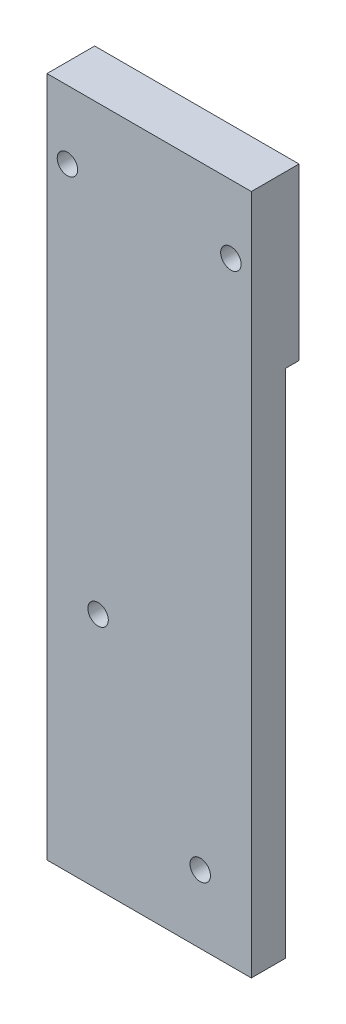
ISO-10303-21;
HEADER;
FILE_DESCRIPTION(('STEP AP214'),'2;1');
FILE_NAME('part.step','',(''),(''),'','','');
FILE_SCHEMA(('AUTOMOTIVE_DESIGN { 1 0 10303 214 1 1 1 1 }'));
ENDSEC;
DATA;
#1=APPLICATION_CONTEXT('core data for automotive mechanical design processes');
#2=APPLICATION_PROTOCOL_DEFINITION('international standard','automotive_design',2000,#1);
#3=PRODUCT_CONTEXT('',#1,'mechanical');
#4=PRODUCT('Part','Part','',(#3));
#5=PRODUCT_RELATED_PRODUCT_CATEGORY('part','',(#4));
#6=PRODUCT_DEFINITION_FORMATION('','',#4);
#7=PRODUCT_DEFINITION_CONTEXT('part definition',#1,'design');
#8=PRODUCT_DEFINITION('design','',#6,#7);
#9=PRODUCT_DEFINITION_SHAPE('','',#8);
#10=(LENGTH_UNIT() NAMED_UNIT(*) SI_UNIT(.MILLI.,.METRE.));
#11=(NAMED_UNIT(*) PLANE_ANGLE_UNIT() SI_UNIT($,.RADIAN.));
#12=(NAMED_UNIT(*) SI_UNIT($,.STERADIAN.) SOLID_ANGLE_UNIT());
#13=UNCERTAINTY_MEASURE_WITH_UNIT(LENGTH_MEASURE(1.E-05),#10,'distance_accuracy_value','');
#14=(GEOMETRIC_REPRESENTATION_CONTEXT(3) GLOBAL_UNCERTAINTY_ASSIGNED_CONTEXT((#13)) GLOBAL_UNIT_ASSIGNED_CONTEXT((#10,
#11,#12)) REPRESENTATION_CONTEXT('',''));
#15=CARTESIAN_POINT('',(0.,0.,0.));
#16=DIRECTION('',(0.,0.,1.));
#17=DIRECTION('',(1.,0.,0.));
#18=AXIS2_PLACEMENT_3D('',#15,#16,#17);
#19=CARTESIAN_POINT('',(95.4540410385415,-1105.00000000001,7.));
#20=DIRECTION('',(0.,1.,0.));
#21=DIRECTION('',(0.,0.,1.));
#22=AXIS2_PLACEMENT_3D('',#19,#20,#21);
#23=PLANE('',#22);
#24=DIRECTION('',(1.,0.,0.));
#25=VECTOR('',#24,1.);
#26=CARTESIAN_POINT('',(95.4540410385415,-1105.00000000001,2.));
#27=LINE('',#26,#25);
#28=CARTESIAN_POINT('',(65.4540410385416,-1105.00000000001,2.));
#29=VERTEX_POINT('',#28);
#30=CARTESIAN_POINT('',(95.4540410385415,-1105.00000000001,2.));
#31=VERTEX_POINT('',#30);
#32=EDGE_CURVE('E120',#29,#31,#27,.T.);
#33=ORIENTED_EDGE('',*,*,#32,.T.);
#34=DIRECTION('',(0.,0.,-1.));
#35=VECTOR('',#34,1.);
#36=CARTESIAN_POINT('',(95.4540410385415,-1105.00000000001,7.));
#37=LINE('',#36,#35);
#38=CARTESIAN_POINT('',(95.4540410385415,-1105.00000000001,7.));
#39=VERTEX_POINT('',#38);
#40=EDGE_CURVE('E45',#39,#31,#37,.T.);
#41=ORIENTED_EDGE('',*,*,#40,.F.);
#42=DIRECTION('',(1.,0.,0.));
#43=VECTOR('',#42,1.);
#44=CARTESIAN_POINT('',(95.4540410385415,-1105.00000000001,7.));
#45=LINE('',#44,#43);
#46=CARTESIAN_POINT('',(65.4540410385416,-1105.00000000001,7.));
#47=VERTEX_POINT('',#46);
#48=EDGE_CURVE('E81',#47,#39,#45,.T.);
#49=ORIENTED_EDGE('',*,*,#48,.F.);
#50=DIRECTION('',(0.,0.,-1.));
#51=VECTOR('',#50,1.);
#52=CARTESIAN_POINT('',(65.4540410385416,-1105.00000000001,7.));
#53=LINE('',#52,#51);
#54=EDGE_CURVE('E11',#47,#29,#53,.T.);
#55=ORIENTED_EDGE('',*,*,#54,.T.);
#56=EDGE_LOOP('',(#33,#41,#49,#55));
#57=FACE_BOUND('',#56,.T.);
#58=ADVANCED_FACE('F38',(#57),#23,.F.);
#59=CARTESIAN_POINT('',(95.4540410385415,-1005.00000000001,7.));
#60=DIRECTION('',(-1.,0.,0.));
#61=DIRECTION('',(0.,0.,1.));
#62=AXIS2_PLACEMENT_3D('',#59,#60,#61);
#63=PLANE('',#62);
#64=DIRECTION('',(0.,1.,0.));
#65=VECTOR('',#64,1.);
#66=CARTESIAN_POINT('',(95.4540410385415,-1005.00000000001,2.));
#67=LINE('',#66,#65);
#68=CARTESIAN_POINT('',(95.4540410385415,-1030.00000000001,2.));
#69=VERTEX_POINT('',#68);
#70=EDGE_CURVE('E74',#31,#69,#67,.T.);
#71=ORIENTED_EDGE('',*,*,#70,.T.);
#72=DIRECTION('',(0.,0.,1.));
#73=VECTOR('',#72,1.);
#74=CARTESIAN_POINT('',(95.4540410385415,-1030.00000000001,0.));
#75=LINE('',#74,#73);
#76=CARTESIAN_POINT('',(95.4540410385415,-1030.00000000001,0.));
#77=VERTEX_POINT('',#76);
#78=EDGE_CURVE('E101',#77,#69,#75,.T.);
#79=ORIENTED_EDGE('',*,*,#78,.F.);
#80=DIRECTION('',(0.,-1.,0.));
#81=VECTOR('',#80,1.);
#82=CARTESIAN_POINT('',(95.4540410385415,-1005.00000000001,0.));
#83=LINE('',#82,#81);
#84=CARTESIAN_POINT('',(95.4540410385415,-1005.00000000001,0.));
#85=VERTEX_POINT('',#84);
#86=EDGE_CURVE('E108',#85,#77,#83,.T.);
#87=ORIENTED_EDGE('',*,*,#86,.F.);
#88=DIRECTION('',(0.,0.,-1.));
#89=VECTOR('',#88,1.);
#90=CARTESIAN_POINT('',(95.4540410385415,-1005.00000000001,7.));
#91=LINE('',#90,#89);
#92=CARTESIAN_POINT('',(95.4540410385415,-1005.00000000001,7.));
#93=VERTEX_POINT('',#92);
#94=EDGE_CURVE('E137',#93,#85,#91,.T.);
#95=ORIENTED_EDGE('',*,*,#94,.F.);
#96=DIRECTION('',(0.,1.,0.));
#97=VECTOR('',#96,1.);
#98=CARTESIAN_POINT('',(95.4540410385415,-1015.00000000001,7.));
#99=LINE('',#98,#97);
#100=EDGE_CURVE('E129',#39,#93,#99,.T.);
#101=ORIENTED_EDGE('',*,*,#100,.F.);
#102=ORIENTED_EDGE('',*,*,#40,.T.);
#103=EDGE_LOOP('',(#71,#79,#87,#95,#101,#102));
#104=FACE_BOUND('',#103,.T.);
#105=ADVANCED_FACE('F118',(#104),#63,.F.);
#106=CARTESIAN_POINT('',(65.4540410385416,-1005.00000000001,7.));
#107=DIRECTION('',(0.,-1.,0.));
#108=DIRECTION('',(0.,0.,-1.));
#109=AXIS2_PLACEMENT_3D('',#106,#107,#108);
#110=PLANE('',#109);
#111=ORIENTED_EDGE('',*,*,#94,.T.);
#112=DIRECTION('',(1.,0.,0.));
#113=VECTOR('',#112,1.);
#114=CARTESIAN_POINT('',(95.4540410385415,-1005.00000000001,0.));
#115=LINE('',#114,#113);
#116=CARTESIAN_POINT('',(65.4540410385416,-1005.00000000001,0.));
#117=VERTEX_POINT('',#116);
#118=EDGE_CURVE('E114',#117,#85,#115,.T.);
#119=ORIENTED_EDGE('',*,*,#118,.F.);
#120=DIRECTION('',(0.,0.,-1.));
#121=VECTOR('',#120,1.);
#122=CARTESIAN_POINT('',(65.4540410385416,-1005.00000000001,7.));
#123=LINE('',#122,#121);
#124=CARTESIAN_POINT('',(65.4540410385416,-1005.00000000001,7.));
#125=VERTEX_POINT('',#124);
#126=EDGE_CURVE('E132',#125,#117,#123,.T.);
#127=ORIENTED_EDGE('',*,*,#126,.F.);
#128=DIRECTION('',(-1.,0.,0.));
#129=VECTOR('',#128,1.);
#130=CARTESIAN_POINT('',(65.4540410385416,-1005.00000000001,7.));
#131=LINE('',#130,#129);
#132=EDGE_CURVE('E131',#93,#125,#131,.T.);
#133=ORIENTED_EDGE('',*,*,#132,.F.);
#134=EDGE_LOOP('',(#111,#119,#127,#133));
#135=FACE_BOUND('',#134,.T.);
#136=ADVANCED_FACE('F197',(#135),#110,.F.);
#137=CARTESIAN_POINT('',(65.4540410385416,-1015.00000000001,7.));
#138=DIRECTION('',(1.,0.,0.));
#139=DIRECTION('',(0.,0.,-1.));
#140=AXIS2_PLACEMENT_3D('',#137,#138,#139);
#141=PLANE('',#140);
#142=ORIENTED_EDGE('',*,*,#126,.T.);
#143=DIRECTION('',(0.,1.,0.));
#144=VECTOR('',#143,1.);
#145=CARTESIAN_POINT('',(65.4540410385416,-1030.00000000001,0.));
#146=LINE('',#145,#144);
#147=CARTESIAN_POINT('',(65.4540410385416,-1030.00000000001,0.));
#148=VERTEX_POINT('',#147);
#149=EDGE_CURVE('E107',#148,#117,#146,.T.);
#150=ORIENTED_EDGE('',*,*,#149,.F.);
#151=DIRECTION('',(0.,0.,1.));
#152=VECTOR('',#151,1.);
#153=CARTESIAN_POINT('',(65.4540410385416,-1030.00000000001,0.));
#154=LINE('',#153,#152);
#155=CARTESIAN_POINT('',(65.4540410385416,-1030.00000000001,2.));
#156=VERTEX_POINT('',#155);
#157=EDGE_CURVE('E103',#148,#156,#154,.T.);
#158=ORIENTED_EDGE('',*,*,#157,.T.);
#159=DIRECTION('',(0.,-1.,0.));
#160=VECTOR('',#159,1.);
#161=CARTESIAN_POINT('',(65.4540410385416,-1015.00000000001,2.));
#162=LINE('',#161,#160);
#163=EDGE_CURVE('E127',#156,#29,#162,.T.);
#164=ORIENTED_EDGE('',*,*,#163,.T.);
#165=ORIENTED_EDGE('',*,*,#54,.F.);
#166=DIRECTION('',(0.,-1.,0.));
#167=VECTOR('',#166,1.);
#168=CARTESIAN_POINT('',(65.4540410385416,-1105.00000000001,7.));
#169=LINE('',#168,#167);
#170=EDGE_CURVE('E61',#125,#47,#169,.T.);
#171=ORIENTED_EDGE('',*,*,#170,.F.);
#172=EDGE_LOOP('',(#142,#150,#158,#164,#165,#171));
#173=FACE_BOUND('',#172,.T.);
#174=ADVANCED_FACE('F141',(#173),#141,.F.);
#175=CARTESIAN_POINT('',(0.,0.,7.));
#176=DIRECTION('',(0.,0.,-1.));
#177=DIRECTION('',(-1.,0.,0.));
#178=AXIS2_PLACEMENT_3D('',#175,#176,#177);
#179=PLANE('',#178);
#180=CARTESIAN_POINT('',(92.4540410384546,-1014.99996309585,7.));
#181=DIRECTION('',(0.,0.,-1.));
#182=DIRECTION('',(-1.,0.,0.));
#183=AXIS2_PLACEMENT_3D('',#180,#181,#182);
#184=CIRCLE('',#183,1.50003690415539);
#185=CARTESIAN_POINT('',(90.9540041342992,-1014.99996309585,7.));
#186=VERTEX_POINT('',#185);
#187=EDGE_CURVE('E155',#186,#186,#184,.T.);
#188=ORIENTED_EDGE('',*,*,#187,.T.);
#189=EDGE_LOOP('',(#188));
#190=FACE_BOUND('',#189,.T.);
#191=CARTESIAN_POINT('',(68.454041038545,-1015.00000000001,7.));
#192=DIRECTION('',(0.,0.,-1.));
#193=DIRECTION('',(-1.,0.,0.));
#194=AXIS2_PLACEMENT_3D('',#191,#192,#193);
#195=CIRCLE('',#194,1.50000000000008);
#196=CARTESIAN_POINT('',(66.954041038545,-1015.00000000001,7.));
#197=VERTEX_POINT('',#196);
#198=EDGE_CURVE('E160',#197,#197,#195,.T.);
#199=ORIENTED_EDGE('',*,*,#198,.T.);
#200=EDGE_LOOP('',(#199));
#201=FACE_BOUND('',#200,.T.);
#202=CARTESIAN_POINT('',(72.9540410385427,-1070.00000000001,7.));
#203=DIRECTION('',(0.,0.,-1.));
#204=DIRECTION('',(-1.,0.,0.));
#205=AXIS2_PLACEMENT_3D('',#202,#203,#204);
#206=CIRCLE('',#205,1.50000000000008);
#207=CARTESIAN_POINT('',(71.4540410385426,-1070.00000000001,7.));
#208=VERTEX_POINT('',#207);
#209=EDGE_CURVE('E140',#208,#208,#206,.T.);
#210=ORIENTED_EDGE('',*,*,#209,.T.);
#211=EDGE_LOOP('',(#210));
#212=FACE_BOUND('',#211,.T.);
#213=CARTESIAN_POINT('',(87.9540410385427,-1095.00000000001,7.));
#214=DIRECTION('',(0.,0.,-1.));
#215=DIRECTION('',(-1.,0.,0.));
#216=AXIS2_PLACEMENT_3D('',#213,#214,#215);
#217=CIRCLE('',#216,1.50000000000007);
#218=CARTESIAN_POINT('',(86.4540410385426,-1095.00000000001,7.));
#219=VERTEX_POINT('',#218);
#220=EDGE_CURVE('E148',#219,#219,#217,.T.);
#221=ORIENTED_EDGE('',*,*,#220,.T.);
#222=EDGE_LOOP('',(#221));
#223=FACE_BOUND('',#222,.T.);
#224=ORIENTED_EDGE('',*,*,#170,.T.);
#225=ORIENTED_EDGE('',*,*,#48,.T.);
#226=ORIENTED_EDGE('',*,*,#100,.T.);
#227=ORIENTED_EDGE('',*,*,#132,.T.);
#228=EDGE_LOOP('',(#224,#225,#226,#227));
#229=FACE_BOUND('',#228,.T.);
#230=ADVANCED_FACE('F186',(#190,#201,#212,#223,#229),#179,.F.);
#231=CARTESIAN_POINT('',(0.,0.,2.));
#232=DIRECTION('',(0.,0.,-1.));
#233=DIRECTION('',(-1.,0.,0.));
#234=AXIS2_PLACEMENT_3D('',#231,#232,#233);
#235=PLANE('',#234);
#236=CARTESIAN_POINT('',(72.9540410385427,-1070.00000000001,2.));
#237=DIRECTION('',(0.,0.,-1.));
#238=DIRECTION('',(-1.,0.,0.));
#239=AXIS2_PLACEMENT_3D('',#236,#237,#238);
#240=CIRCLE('',#239,1.50000000000008);
#241=CARTESIAN_POINT('',(71.4540410385426,-1070.00000000001,2.));
#242=VERTEX_POINT('',#241);
#243=EDGE_CURVE('E151',#242,#242,#240,.T.);
#244=ORIENTED_EDGE('',*,*,#243,.F.);
#245=EDGE_LOOP('',(#244));
#246=FACE_BOUND('',#245,.T.);
#247=CARTESIAN_POINT('',(87.9540410385427,-1095.00000000001,2.));
#248=DIRECTION('',(0.,0.,-1.));
#249=DIRECTION('',(-1.,0.,0.));
#250=AXIS2_PLACEMENT_3D('',#247,#248,#249);
#251=CIRCLE('',#250,1.50000000000007);
#252=CARTESIAN_POINT('',(86.4540410385426,-1095.00000000001,2.));
#253=VERTEX_POINT('',#252);
#254=EDGE_CURVE('E152',#253,#253,#251,.T.);
#255=ORIENTED_EDGE('',*,*,#254,.F.);
#256=EDGE_LOOP('',(#255));
#257=FACE_BOUND('',#256,.T.);
#258=DIRECTION('',(-1.,0.,0.));
#259=VECTOR('',#258,1.);
#260=CARTESIAN_POINT('',(95.4540410385415,-1030.00000000001,2.));
#261=LINE('',#260,#259);
#262=EDGE_CURVE('E52',#69,#156,#261,.T.);
#263=ORIENTED_EDGE('',*,*,#262,.F.);
#264=ORIENTED_EDGE('',*,*,#70,.F.);
#265=ORIENTED_EDGE('',*,*,#32,.F.);
#266=ORIENTED_EDGE('',*,*,#163,.F.);
#267=EDGE_LOOP('',(#263,#264,#265,#266));
#268=FACE_BOUND('',#267,.T.);
#269=ADVANCED_FACE('F139',(#246,#257,#268),#235,.T.);
#270=CARTESIAN_POINT('',(95.4540410385415,-1030.00000000001,0.));
#271=DIRECTION('',(0.,1.,0.));
#272=DIRECTION('',(0.,0.,1.));
#273=AXIS2_PLACEMENT_3D('',#270,#271,#272);
#274=PLANE('',#273);
#275=ORIENTED_EDGE('',*,*,#262,.T.);
#276=ORIENTED_EDGE('',*,*,#157,.F.);
#277=DIRECTION('',(-1.,0.,0.));
#278=VECTOR('',#277,1.);
#279=CARTESIAN_POINT('',(95.4540410385415,-1030.00000000001,0.));
#280=LINE('',#279,#278);
#281=EDGE_CURVE('E97',#77,#148,#280,.T.);
#282=ORIENTED_EDGE('',*,*,#281,.F.);
#283=ORIENTED_EDGE('',*,*,#78,.T.);
#284=EDGE_LOOP('',(#275,#276,#282,#283));
#285=FACE_BOUND('',#284,.T.);
#286=ADVANCED_FACE('F99',(#285),#274,.F.);
#287=CARTESIAN_POINT('',(0.,0.,0.));
#288=DIRECTION('',(0.,0.,-1.));
#289=DIRECTION('',(-1.,0.,0.));
#290=AXIS2_PLACEMENT_3D('',#287,#288,#289);
#291=PLANE('',#290);
#292=CARTESIAN_POINT('',(92.4540410384546,-1014.99996309585,0.));
#293=DIRECTION('',(0.,0.,-1.));
#294=DIRECTION('',(-1.,0.,0.));
#295=AXIS2_PLACEMENT_3D('',#292,#293,#294);
#296=CIRCLE('',#295,1.50003690415539);
#297=CARTESIAN_POINT('',(90.9540041342992,-1014.99996309585,0.));
#298=VERTEX_POINT('',#297);
#299=EDGE_CURVE('E163',#298,#298,#296,.T.);
#300=ORIENTED_EDGE('',*,*,#299,.F.);
#301=EDGE_LOOP('',(#300));
#302=FACE_BOUND('',#301,.T.);
#303=CARTESIAN_POINT('',(68.454041038545,-1015.00000000001,0.));
#304=DIRECTION('',(0.,0.,-1.));
#305=DIRECTION('',(-1.,0.,0.));
#306=AXIS2_PLACEMENT_3D('',#303,#304,#305);
#307=CIRCLE('',#306,1.50000000000008);
#308=CARTESIAN_POINT('',(66.954041038545,-1015.00000000001,0.));
#309=VERTEX_POINT('',#308);
#310=EDGE_CURVE('E164',#309,#309,#307,.T.);
#311=ORIENTED_EDGE('',*,*,#310,.F.);
#312=EDGE_LOOP('',(#311));
#313=FACE_BOUND('',#312,.T.);
#314=ORIENTED_EDGE('',*,*,#86,.T.);
#315=ORIENTED_EDGE('',*,*,#281,.T.);
#316=ORIENTED_EDGE('',*,*,#149,.T.);
#317=ORIENTED_EDGE('',*,*,#118,.T.);
#318=EDGE_LOOP('',(#314,#315,#316,#317));
#319=FACE_BOUND('',#318,.T.);
#320=ADVANCED_FACE('F112',(#302,#313,#319),#291,.T.);
#321=CARTESIAN_POINT('',(87.9540410385427,-1095.00000000001,12.));
#322=DIRECTION('',(0.,0.,-1.));
#323=DIRECTION('',(-1.,0.,0.));
#324=AXIS2_PLACEMENT_3D('',#321,#322,#323);
#325=CYLINDRICAL_SURFACE('',#324,1.50000000000007);
#326=ORIENTED_EDGE('',*,*,#254,.T.);
#327=EDGE_LOOP('',(#326));
#328=FACE_BOUND('',#327,.T.);
#329=ORIENTED_EDGE('',*,*,#220,.F.);
#330=EDGE_LOOP('',(#329));
#331=FACE_BOUND('',#330,.T.);
#332=ADVANCED_FACE('F175',(#328,#331),#325,.F.);
#333=CARTESIAN_POINT('',(72.9540410385427,-1070.00000000001,12.));
#334=DIRECTION('',(0.,0.,-1.));
#335=DIRECTION('',(-1.,0.,0.));
#336=AXIS2_PLACEMENT_3D('',#333,#334,#335);
#337=CYLINDRICAL_SURFACE('',#336,1.50000000000008);
#338=ORIENTED_EDGE('',*,*,#243,.T.);
#339=EDGE_LOOP('',(#338));
#340=FACE_BOUND('',#339,.T.);
#341=ORIENTED_EDGE('',*,*,#209,.F.);
#342=EDGE_LOOP('',(#341));
#343=FACE_BOUND('',#342,.T.);
#344=ADVANCED_FACE('F182',(#340,#343),#337,.F.);
#345=CARTESIAN_POINT('',(68.454041038545,-1015.00000000001,10.));
#346=DIRECTION('',(0.,0.,-1.));
#347=DIRECTION('',(-1.,0.,0.));
#348=AXIS2_PLACEMENT_3D('',#345,#346,#347);
#349=CYLINDRICAL_SURFACE('',#348,1.50000000000008);
#350=ORIENTED_EDGE('',*,*,#310,.T.);
#351=EDGE_LOOP('',(#350));
#352=FACE_BOUND('',#351,.T.);
#353=ORIENTED_EDGE('',*,*,#198,.F.);
#354=EDGE_LOOP('',(#353));
#355=FACE_BOUND('',#354,.T.);
#356=ADVANCED_FACE('F179',(#352,#355),#349,.F.);
#357=CARTESIAN_POINT('',(92.4540410384546,-1014.99996309585,10.));
#358=DIRECTION('',(0.,0.,-1.));
#359=DIRECTION('',(-1.,0.,0.));
#360=AXIS2_PLACEMENT_3D('',#357,#358,#359);
#361=CYLINDRICAL_SURFACE('',#360,1.50003690415539);
#362=ORIENTED_EDGE('',*,*,#299,.T.);
#363=EDGE_LOOP('',(#362));
#364=FACE_BOUND('',#363,.T.);
#365=ORIENTED_EDGE('',*,*,#187,.F.);
#366=EDGE_LOOP('',(#365));
#367=FACE_BOUND('',#366,.T.);
#368=ADVANCED_FACE('F170',(#364,#367),#361,.F.);
#369=CLOSED_SHELL('',(#58,#105,#136,#174,#230,#269,#286,#320,#332,#344,#356,#368));
#370=MANIFOLD_SOLID_BREP('B2',#369);
#371=ADVANCED_BREP_SHAPE_REPRESENTATION('',(#18,#370),#14);
#372=SHAPE_DEFINITION_REPRESENTATION(#9,#371);
ENDSEC;
END-ISO-10303-21;
